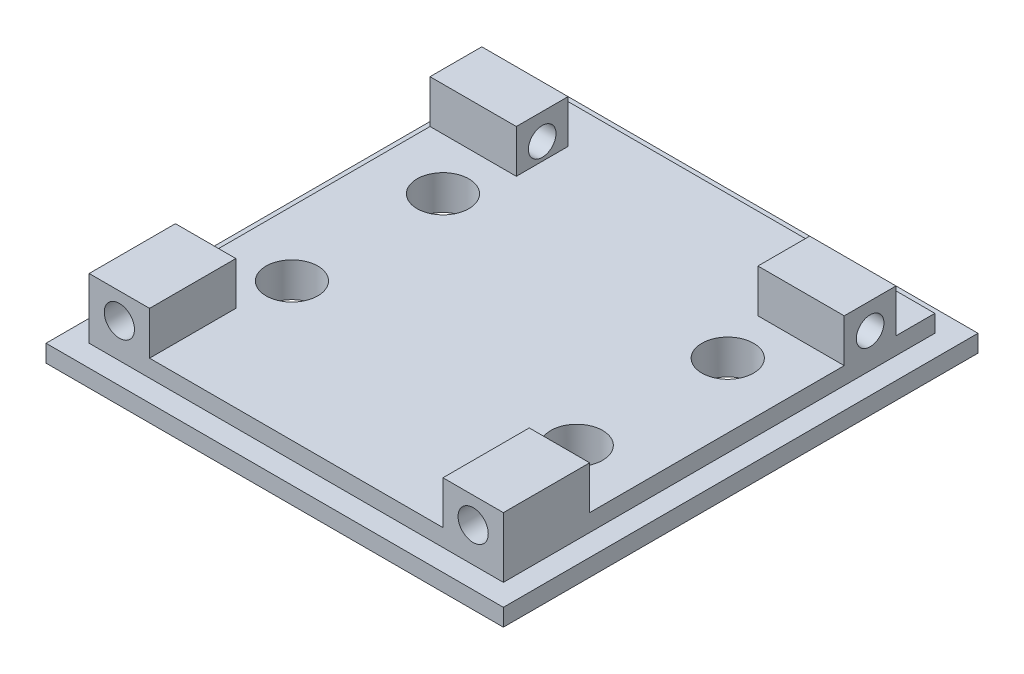
ISO-10303-21;
HEADER;
FILE_DESCRIPTION(('STEP AP214'),'2;1');
FILE_NAME('part.step','',(''),(''),'','','');
FILE_SCHEMA(('AUTOMOTIVE_DESIGN { 1 0 10303 214 1 1 1 1 }'));
ENDSEC;
DATA;
#1=APPLICATION_CONTEXT('core data for automotive mechanical design processes');
#2=APPLICATION_PROTOCOL_DEFINITION('international standard','automotive_design',2000,#1);
#3=PRODUCT_CONTEXT('',#1,'mechanical');
#4=PRODUCT('Part','Part','',(#3));
#5=PRODUCT_RELATED_PRODUCT_CATEGORY('part','',(#4));
#6=PRODUCT_DEFINITION_FORMATION('','',#4);
#7=PRODUCT_DEFINITION_CONTEXT('part definition',#1,'design');
#8=PRODUCT_DEFINITION('design','',#6,#7);
#9=PRODUCT_DEFINITION_SHAPE('','',#8);
#10=(LENGTH_UNIT() NAMED_UNIT(*) SI_UNIT(.MILLI.,.METRE.));
#11=(NAMED_UNIT(*) PLANE_ANGLE_UNIT() SI_UNIT($,.RADIAN.));
#12=(NAMED_UNIT(*) SI_UNIT($,.STERADIAN.) SOLID_ANGLE_UNIT());
#13=UNCERTAINTY_MEASURE_WITH_UNIT(LENGTH_MEASURE(1.E-05),#10,'distance_accuracy_value','');
#14=(GEOMETRIC_REPRESENTATION_CONTEXT(3) GLOBAL_UNCERTAINTY_ASSIGNED_CONTEXT((#13)) GLOBAL_UNIT_ASSIGNED_CONTEXT((#10,
#11,#12)) REPRESENTATION_CONTEXT('',''));
#15=CARTESIAN_POINT('',(0.,0.,0.));
#16=DIRECTION('',(0.,0.,1.));
#17=DIRECTION('',(1.,0.,0.));
#18=AXIS2_PLACEMENT_3D('',#15,#16,#17);
#19=CARTESIAN_POINT('',(0.,4.,0.));
#20=DIRECTION('',(0.,1.,0.));
#21=DIRECTION('',(0.,0.,1.));
#22=AXIS2_PLACEMENT_3D('',#19,#20,#21);
#23=PLANE('',#22);
#24=CARTESIAN_POINT('',(16.5,4.,-8.5));
#25=DIRECTION('',(0.,1.,0.));
#26=DIRECTION('',(0.,0.,-1.));
#27=AXIS2_PLACEMENT_3D('',#24,#25,#26);
#28=CIRCLE('',#27,2.99999999999999);
#29=CARTESIAN_POINT('',(16.5,4.,-11.5));
#30=VERTEX_POINT('',#29);
#31=EDGE_CURVE('E735',#30,#30,#28,.T.);
#32=ORIENTED_EDGE('',*,*,#31,.F.);
#33=EDGE_LOOP('',(#32));
#34=FACE_BOUND('',#33,.T.);
#35=CARTESIAN_POINT('',(16.5,4.,9.));
#36=DIRECTION('',(0.,1.,0.));
#37=DIRECTION('',(0.,0.,-1.));
#38=AXIS2_PLACEMENT_3D('',#35,#36,#37);
#39=CIRCLE('',#38,2.99999999999999);
#40=CARTESIAN_POINT('',(16.5,4.,6.));
#41=VERTEX_POINT('',#40);
#42=EDGE_CURVE('E737',#41,#41,#39,.T.);
#43=ORIENTED_EDGE('',*,*,#42,.F.);
#44=EDGE_LOOP('',(#43));
#45=FACE_BOUND('',#44,.T.);
#46=CARTESIAN_POINT('',(-16.5,4.,-8.5));
#47=DIRECTION('',(0.,1.,0.));
#48=DIRECTION('',(0.,0.,1.));
#49=AXIS2_PLACEMENT_3D('',#46,#47,#48);
#50=CIRCLE('',#49,3.);
#51=CARTESIAN_POINT('',(-16.5,4.,-5.5));
#52=VERTEX_POINT('',#51);
#53=EDGE_CURVE('E745',#52,#52,#50,.T.);
#54=ORIENTED_EDGE('',*,*,#53,.F.);
#55=EDGE_LOOP('',(#54));
#56=FACE_BOUND('',#55,.T.);
#57=CARTESIAN_POINT('',(-16.5,4.,9.));
#58=DIRECTION('',(0.,1.,0.));
#59=DIRECTION('',(0.,0.,1.));
#60=AXIS2_PLACEMENT_3D('',#57,#58,#59);
#61=CIRCLE('',#60,3.);
#62=CARTESIAN_POINT('',(-16.5,4.,12.));
#63=VERTEX_POINT('',#62);
#64=EDGE_CURVE('E751',#63,#63,#61,.T.);
#65=ORIENTED_EDGE('',*,*,#64,.F.);
#66=EDGE_LOOP('',(#65));
#67=FACE_BOUND('',#66,.T.);
#68=DIRECTION('',(0.,0.,1.));
#69=VECTOR('',#68,1.);
#70=CARTESIAN_POINT('',(-24.,4.,25.));
#71=LINE('',#70,#69);
#72=CARTESIAN_POINT('',(-24.,4.,-25.));
#73=VERTEX_POINT('',#72);
#74=CARTESIAN_POINT('',(-24.,4.,-20.5));
#75=VERTEX_POINT('',#74);
#76=EDGE_CURVE('E289',#73,#75,#71,.T.);
#77=ORIENTED_EDGE('',*,*,#76,.T.);
#78=DIRECTION('',(-1.,0.,0.));
#79=VECTOR('',#78,1.);
#80=CARTESIAN_POINT('',(-24.,4.,-20.5));
#81=LINE('',#80,#79);
#82=CARTESIAN_POINT('',(-14.,4.,-20.5));
#83=VERTEX_POINT('',#82);
#84=EDGE_CURVE('E56',#83,#75,#81,.T.);
#85=ORIENTED_EDGE('',*,*,#84,.F.);
#86=DIRECTION('',(0.,0.,-1.));
#87=VECTOR('',#86,1.);
#88=CARTESIAN_POINT('',(-14.,4.,-20.5));
#89=LINE('',#88,#87);
#90=CARTESIAN_POINT('',(-14.,4.,-14.5));
#91=VERTEX_POINT('',#90);
#92=EDGE_CURVE('E51',#91,#83,#89,.T.);
#93=ORIENTED_EDGE('',*,*,#92,.F.);
#94=DIRECTION('',(1.,0.,0.));
#95=VECTOR('',#94,1.);
#96=CARTESIAN_POINT('',(-24.,4.,-14.5));
#97=LINE('',#96,#95);
#98=CARTESIAN_POINT('',(-24.,4.,-14.5));
#99=VERTEX_POINT('',#98);
#100=EDGE_CURVE('E782',#99,#91,#97,.T.);
#101=ORIENTED_EDGE('',*,*,#100,.F.);
#102=CARTESIAN_POINT('',(-24.,4.,15.));
#103=VERTEX_POINT('',#102);
#104=EDGE_CURVE('E288',#99,#103,#71,.T.);
#105=ORIENTED_EDGE('',*,*,#104,.T.);
#106=DIRECTION('',(-1.,0.,0.));
#107=VECTOR('',#106,1.);
#108=CARTESIAN_POINT('',(-24.,4.,15.));
#109=LINE('',#108,#107);
#110=CARTESIAN_POINT('',(-17.,4.,15.));
#111=VERTEX_POINT('',#110);
#112=EDGE_CURVE('E268',#111,#103,#109,.T.);
#113=ORIENTED_EDGE('',*,*,#112,.F.);
#114=DIRECTION('',(0.,0.,-1.));
#115=VECTOR('',#114,1.);
#116=CARTESIAN_POINT('',(-17.,4.,25.));
#117=LINE('',#116,#115);
#118=CARTESIAN_POINT('',(-17.,4.,25.));
#119=VERTEX_POINT('',#118);
#120=EDGE_CURVE('E263',#119,#111,#117,.T.);
#121=ORIENTED_EDGE('',*,*,#120,.F.);
#122=DIRECTION('',(1.,0.,0.));
#123=VECTOR('',#122,1.);
#124=CARTESIAN_POINT('',(24.,4.,25.));
#125=LINE('',#124,#123);
#126=CARTESIAN_POINT('',(17.,4.,25.));
#127=VERTEX_POINT('',#126);
#128=EDGE_CURVE('E298',#119,#127,#125,.T.);
#129=ORIENTED_EDGE('',*,*,#128,.T.);
#130=DIRECTION('',(0.,0.,1.));
#131=VECTOR('',#130,1.);
#132=CARTESIAN_POINT('',(17.,4.,25.));
#133=LINE('',#132,#131);
#134=CARTESIAN_POINT('',(17.,4.,15.));
#135=VERTEX_POINT('',#134);
#136=EDGE_CURVE('E247',#135,#127,#133,.T.);
#137=ORIENTED_EDGE('',*,*,#136,.F.);
#138=DIRECTION('',(-1.,0.,0.));
#139=VECTOR('',#138,1.);
#140=CARTESIAN_POINT('',(24.,4.,15.));
#141=LINE('',#140,#139);
#142=CARTESIAN_POINT('',(24.,4.,15.));
#143=VERTEX_POINT('',#142);
#144=EDGE_CURVE('E242',#143,#135,#141,.T.);
#145=ORIENTED_EDGE('',*,*,#144,.F.);
#146=DIRECTION('',(0.,0.,-1.));
#147=VECTOR('',#146,1.);
#148=CARTESIAN_POINT('',(24.,4.,25.));
#149=LINE('',#148,#147);
#150=CARTESIAN_POINT('',(24.,4.,-14.5));
#151=VERTEX_POINT('',#150);
#152=EDGE_CURVE('E334',#143,#151,#149,.T.);
#153=ORIENTED_EDGE('',*,*,#152,.T.);
#154=DIRECTION('',(1.,0.,0.));
#155=VECTOR('',#154,1.);
#156=CARTESIAN_POINT('',(24.,4.,-14.5));
#157=LINE('',#156,#155);
#158=CARTESIAN_POINT('',(14.,4.,-14.5));
#159=VERTEX_POINT('',#158);
#160=EDGE_CURVE('E220',#159,#151,#157,.T.);
#161=ORIENTED_EDGE('',*,*,#160,.F.);
#162=DIRECTION('',(0.,0.,1.));
#163=VECTOR('',#162,1.);
#164=CARTESIAN_POINT('',(14.,4.,-20.5));
#165=LINE('',#164,#163);
#166=CARTESIAN_POINT('',(14.,4.,-20.5));
#167=VERTEX_POINT('',#166);
#168=EDGE_CURVE('E210',#167,#159,#165,.T.);
#169=ORIENTED_EDGE('',*,*,#168,.F.);
#170=DIRECTION('',(-1.,0.,0.));
#171=VECTOR('',#170,1.);
#172=CARTESIAN_POINT('',(24.,4.,-20.5));
#173=LINE('',#172,#171);
#174=CARTESIAN_POINT('',(24.,4.,-20.5));
#175=VERTEX_POINT('',#174);
#176=EDGE_CURVE('E207',#175,#167,#173,.T.);
#177=ORIENTED_EDGE('',*,*,#176,.F.);
#178=CARTESIAN_POINT('',(24.,4.,-25.));
#179=VERTEX_POINT('',#178);
#180=EDGE_CURVE('E302',#175,#179,#149,.T.);
#181=ORIENTED_EDGE('',*,*,#180,.T.);
#182=DIRECTION('',(-1.,0.,0.));
#183=VECTOR('',#182,1.);
#184=CARTESIAN_POINT('',(24.,4.,-25.));
#185=LINE('',#184,#183);
#186=EDGE_CURVE('E344',#179,#73,#185,.T.);
#187=ORIENTED_EDGE('',*,*,#186,.T.);
#188=EDGE_LOOP('',(#77,#85,#93,#101,#105,#113,#121,#129,#137,#145,#153,#161,#169,#177,#181,#187));
#189=FACE_BOUND('',#188,.T.);
#190=ADVANCED_FACE('F34',(#34,#45,#56,#67,#189),#23,.T.);
#191=CARTESIAN_POINT('',(0.,2.,0.));
#192=DIRECTION('',(0.,1.,0.));
#193=DIRECTION('',(0.,0.,1.));
#194=AXIS2_PLACEMENT_3D('',#191,#192,#193);
#195=PLANE('',#194);
#196=DIRECTION('',(0.,0.,1.));
#197=VECTOR('',#196,1.);
#198=CARTESIAN_POINT('',(-26.5,2.,27.5));
#199=LINE('',#198,#197);
#200=CARTESIAN_POINT('',(-26.5,2.,-27.5));
#201=VERTEX_POINT('',#200);
#202=CARTESIAN_POINT('',(-26.5,2.,27.5));
#203=VERTEX_POINT('',#202);
#204=EDGE_CURVE('E362',#201,#203,#199,.T.);
#205=ORIENTED_EDGE('',*,*,#204,.T.);
#206=DIRECTION('',(1.,0.,0.));
#207=VECTOR('',#206,1.);
#208=CARTESIAN_POINT('',(26.5,2.,27.5));
#209=LINE('',#208,#207);
#210=CARTESIAN_POINT('',(26.5,2.,27.5));
#211=VERTEX_POINT('',#210);
#212=EDGE_CURVE('E365',#203,#211,#209,.T.);
#213=ORIENTED_EDGE('',*,*,#212,.T.);
#214=DIRECTION('',(0.,0.,-1.));
#215=VECTOR('',#214,1.);
#216=CARTESIAN_POINT('',(26.5,2.,27.5));
#217=LINE('',#216,#215);
#218=CARTESIAN_POINT('',(26.5,2.,-27.5));
#219=VERTEX_POINT('',#218);
#220=EDGE_CURVE('E368',#211,#219,#217,.T.);
#221=ORIENTED_EDGE('',*,*,#220,.T.);
#222=DIRECTION('',(-1.,0.,0.));
#223=VECTOR('',#222,1.);
#224=CARTESIAN_POINT('',(26.5,2.,-27.5));
#225=LINE('',#224,#223);
#226=EDGE_CURVE('E370',#219,#201,#225,.T.);
#227=ORIENTED_EDGE('',*,*,#226,.T.);
#228=EDGE_LOOP('',(#205,#213,#221,#227));
#229=FACE_BOUND('',#228,.T.);
#230=DIRECTION('',(1.,0.,0.));
#231=VECTOR('',#230,1.);
#232=CARTESIAN_POINT('',(24.,2.,25.));
#233=LINE('',#232,#231);
#234=CARTESIAN_POINT('',(-24.,2.,25.));
#235=VERTEX_POINT('',#234);
#236=CARTESIAN_POINT('',(24.,2.,25.));
#237=VERTEX_POINT('',#236);
#238=EDGE_CURVE('E312',#235,#237,#233,.T.);
#239=ORIENTED_EDGE('',*,*,#238,.F.);
#240=DIRECTION('',(0.,0.,1.));
#241=VECTOR('',#240,1.);
#242=CARTESIAN_POINT('',(-24.,2.,25.));
#243=LINE('',#242,#241);
#244=CARTESIAN_POINT('',(-24.,2.,-25.));
#245=VERTEX_POINT('',#244);
#246=EDGE_CURVE('E308',#245,#235,#243,.T.);
#247=ORIENTED_EDGE('',*,*,#246,.F.);
#248=DIRECTION('',(-1.,0.,0.));
#249=VECTOR('',#248,1.);
#250=CARTESIAN_POINT('',(24.,2.,-25.));
#251=LINE('',#250,#249);
#252=CARTESIAN_POINT('',(24.,2.,-25.));
#253=VERTEX_POINT('',#252);
#254=EDGE_CURVE('E290',#253,#245,#251,.T.);
#255=ORIENTED_EDGE('',*,*,#254,.F.);
#256=DIRECTION('',(0.,0.,-1.));
#257=VECTOR('',#256,1.);
#258=CARTESIAN_POINT('',(24.,2.,25.));
#259=LINE('',#258,#257);
#260=EDGE_CURVE('E349',#237,#253,#259,.T.);
#261=ORIENTED_EDGE('',*,*,#260,.F.);
#262=EDGE_LOOP('',(#239,#247,#255,#261));
#263=FACE_BOUND('',#262,.T.);
#264=ADVANCED_FACE('F404',(#229,#263),#195,.T.);
#265=CARTESIAN_POINT('',(-26.5,2.,27.5));
#266=DIRECTION('',(1.,0.,0.));
#267=DIRECTION('',(0.,0.,-1.));
#268=AXIS2_PLACEMENT_3D('',#265,#266,#267);
#269=PLANE('',#268);
#270=DIRECTION('',(0.,0.,1.));
#271=VECTOR('',#270,1.);
#272=CARTESIAN_POINT('',(-26.5,0.,27.5));
#273=LINE('',#272,#271);
#274=CARTESIAN_POINT('',(-26.5,0.,-27.5));
#275=VERTEX_POINT('',#274);
#276=CARTESIAN_POINT('',(-26.5,0.,27.5));
#277=VERTEX_POINT('',#276);
#278=EDGE_CURVE('E361',#275,#277,#273,.T.);
#279=ORIENTED_EDGE('',*,*,#278,.T.);
#280=DIRECTION('',(0.,-1.,0.));
#281=VECTOR('',#280,1.);
#282=CARTESIAN_POINT('',(-26.5,2.,27.5));
#283=LINE('',#282,#281);
#284=EDGE_CURVE('E12',#203,#277,#283,.T.);
#285=ORIENTED_EDGE('',*,*,#284,.F.);
#286=ORIENTED_EDGE('',*,*,#204,.F.);
#287=DIRECTION('',(0.,-1.,0.));
#288=VECTOR('',#287,1.);
#289=CARTESIAN_POINT('',(-26.5,2.,-27.5));
#290=LINE('',#289,#288);
#291=EDGE_CURVE('E372',#201,#275,#290,.T.);
#292=ORIENTED_EDGE('',*,*,#291,.T.);
#293=EDGE_LOOP('',(#279,#285,#286,#292));
#294=FACE_BOUND('',#293,.T.);
#295=ADVANCED_FACE('F36',(#294),#269,.F.);
#296=CARTESIAN_POINT('',(26.5,2.,27.5));
#297=DIRECTION('',(0.,0.,-1.));
#298=DIRECTION('',(-1.,0.,0.));
#299=AXIS2_PLACEMENT_3D('',#296,#297,#298);
#300=PLANE('',#299);
#301=DIRECTION('',(1.,0.,0.));
#302=VECTOR('',#301,1.);
#303=CARTESIAN_POINT('',(26.5,0.,27.5));
#304=LINE('',#303,#302);
#305=CARTESIAN_POINT('',(26.5,0.,27.5));
#306=VERTEX_POINT('',#305);
#307=EDGE_CURVE('E375',#277,#306,#304,.T.);
#308=ORIENTED_EDGE('',*,*,#307,.T.);
#309=DIRECTION('',(0.,-1.,0.));
#310=VECTOR('',#309,1.);
#311=CARTESIAN_POINT('',(26.5,2.,27.5));
#312=LINE('',#311,#310);
#313=EDGE_CURVE('E43',#211,#306,#312,.T.);
#314=ORIENTED_EDGE('',*,*,#313,.F.);
#315=ORIENTED_EDGE('',*,*,#212,.F.);
#316=ORIENTED_EDGE('',*,*,#284,.T.);
#317=EDGE_LOOP('',(#308,#314,#315,#316));
#318=FACE_BOUND('',#317,.T.);
#319=ADVANCED_FACE('F406',(#318),#300,.F.);
#320=CARTESIAN_POINT('',(26.5,2.,27.5));
#321=DIRECTION('',(-1.,0.,0.));
#322=DIRECTION('',(0.,0.,1.));
#323=AXIS2_PLACEMENT_3D('',#320,#321,#322);
#324=PLANE('',#323);
#325=DIRECTION('',(0.,0.,-1.));
#326=VECTOR('',#325,1.);
#327=CARTESIAN_POINT('',(26.5,0.,27.5));
#328=LINE('',#327,#326);
#329=CARTESIAN_POINT('',(26.5,0.,-27.5));
#330=VERTEX_POINT('',#329);
#331=EDGE_CURVE('E377',#306,#330,#328,.T.);
#332=ORIENTED_EDGE('',*,*,#331,.T.);
#333=DIRECTION('',(0.,-1.,0.));
#334=VECTOR('',#333,1.);
#335=CARTESIAN_POINT('',(26.5,2.,-27.5));
#336=LINE('',#335,#334);
#337=EDGE_CURVE('E382',#219,#330,#336,.T.);
#338=ORIENTED_EDGE('',*,*,#337,.F.);
#339=ORIENTED_EDGE('',*,*,#220,.F.);
#340=ORIENTED_EDGE('',*,*,#313,.T.);
#341=EDGE_LOOP('',(#332,#338,#339,#340));
#342=FACE_BOUND('',#341,.T.);
#343=ADVANCED_FACE('F389',(#342),#324,.F.);
#344=CARTESIAN_POINT('',(26.5,2.,-27.5));
#345=DIRECTION('',(0.,0.,1.));
#346=DIRECTION('',(1.,0.,0.));
#347=AXIS2_PLACEMENT_3D('',#344,#345,#346);
#348=PLANE('',#347);
#349=DIRECTION('',(-1.,0.,0.));
#350=VECTOR('',#349,1.);
#351=CARTESIAN_POINT('',(26.5,0.,-27.5));
#352=LINE('',#351,#350);
#353=EDGE_CURVE('E366',#330,#275,#352,.T.);
#354=ORIENTED_EDGE('',*,*,#353,.T.);
#355=ORIENTED_EDGE('',*,*,#291,.F.);
#356=ORIENTED_EDGE('',*,*,#226,.F.);
#357=ORIENTED_EDGE('',*,*,#337,.T.);
#358=EDGE_LOOP('',(#354,#355,#356,#357));
#359=FACE_BOUND('',#358,.T.);
#360=ADVANCED_FACE('F398',(#359),#348,.F.);
#361=CARTESIAN_POINT('',(0.,0.,0.));
#362=DIRECTION('',(0.,1.,0.));
#363=DIRECTION('',(0.,0.,1.));
#364=AXIS2_PLACEMENT_3D('',#361,#362,#363);
#365=PLANE('',#364);
#366=CARTESIAN_POINT('',(16.5,0.,-8.5));
#367=DIRECTION('',(0.,1.,0.));
#368=DIRECTION('',(0.,0.,1.));
#369=AXIS2_PLACEMENT_3D('',#366,#367,#368);
#370=CIRCLE('',#369,2.99999999999999);
#371=CARTESIAN_POINT('',(16.5,0.,-5.5));
#372=VERTEX_POINT('',#371);
#373=EDGE_CURVE('E733',#372,#372,#370,.F.);
#374=ORIENTED_EDGE('',*,*,#373,.F.);
#375=EDGE_LOOP('',(#374));
#376=FACE_BOUND('',#375,.T.);
#377=CARTESIAN_POINT('',(16.5,0.,9.));
#378=DIRECTION('',(0.,1.,0.));
#379=DIRECTION('',(0.,0.,1.));
#380=AXIS2_PLACEMENT_3D('',#377,#378,#379);
#381=CIRCLE('',#380,2.99999999999999);
#382=CARTESIAN_POINT('',(16.5,0.,12.));
#383=VERTEX_POINT('',#382);
#384=EDGE_CURVE('E742',#383,#383,#381,.F.);
#385=ORIENTED_EDGE('',*,*,#384,.F.);
#386=EDGE_LOOP('',(#385));
#387=FACE_BOUND('',#386,.T.);
#388=CARTESIAN_POINT('',(-16.5,0.,-8.5));
#389=DIRECTION('',(0.,1.,0.));
#390=DIRECTION('',(0.,0.,1.));
#391=AXIS2_PLACEMENT_3D('',#388,#389,#390);
#392=CIRCLE('',#391,3.);
#393=CARTESIAN_POINT('',(-16.5,0.,-5.5));
#394=VERTEX_POINT('',#393);
#395=EDGE_CURVE('E748',#394,#394,#392,.F.);
#396=ORIENTED_EDGE('',*,*,#395,.F.);
#397=EDGE_LOOP('',(#396));
#398=FACE_BOUND('',#397,.T.);
#399=CARTESIAN_POINT('',(-16.5,0.,9.));
#400=DIRECTION('',(0.,1.,0.));
#401=DIRECTION('',(0.,0.,1.));
#402=AXIS2_PLACEMENT_3D('',#399,#400,#401);
#403=CIRCLE('',#402,3.);
#404=CARTESIAN_POINT('',(-16.5,0.,12.));
#405=VERTEX_POINT('',#404);
#406=EDGE_CURVE('E754',#405,#405,#403,.F.);
#407=ORIENTED_EDGE('',*,*,#406,.F.);
#408=EDGE_LOOP('',(#407));
#409=FACE_BOUND('',#408,.T.);
#410=ORIENTED_EDGE('',*,*,#278,.F.);
#411=ORIENTED_EDGE('',*,*,#353,.F.);
#412=ORIENTED_EDGE('',*,*,#331,.F.);
#413=ORIENTED_EDGE('',*,*,#307,.F.);
#414=EDGE_LOOP('',(#410,#411,#412,#413));
#415=FACE_BOUND('',#414,.T.);
#416=ADVANCED_FACE('F395',(#376,#387,#398,#409,#415),#365,.F.);
#417=CARTESIAN_POINT('',(-24.,4.,25.));
#418=DIRECTION('',(1.,0.,0.));
#419=DIRECTION('',(0.,0.,-1.));
#420=AXIS2_PLACEMENT_3D('',#417,#418,#419);
#421=PLANE('',#420);
#422=CARTESIAN_POINT('',(-24.,6.,-17.5));
#423=DIRECTION('',(1.,0.,0.));
#424=DIRECTION('',(0.,0.,-1.));
#425=AXIS2_PLACEMENT_3D('',#422,#423,#424);
#426=CIRCLE('',#425,1.6);
#427=CARTESIAN_POINT('',(-24.,6.,-19.1));
#428=VERTEX_POINT('',#427);
#429=EDGE_CURVE('E760',#428,#428,#426,.F.);
#430=ORIENTED_EDGE('',*,*,#429,.F.);
#431=EDGE_LOOP('',(#430));
#432=FACE_BOUND('',#431,.T.);
#433=ORIENTED_EDGE('',*,*,#246,.T.);
#434=DIRECTION('',(0.,-1.,0.));
#435=VECTOR('',#434,1.);
#436=CARTESIAN_POINT('',(-24.,4.,25.));
#437=LINE('',#436,#435);
#438=CARTESIAN_POINT('',(-24.,9.,25.));
#439=VERTEX_POINT('',#438);
#440=EDGE_CURVE('E359',#439,#235,#437,.T.);
#441=ORIENTED_EDGE('',*,*,#440,.F.);
#442=DIRECTION('',(0.,0.,1.));
#443=VECTOR('',#442,1.);
#444=CARTESIAN_POINT('',(-24.,9.,25.));
#445=LINE('',#444,#443);
#446=CARTESIAN_POINT('',(-24.,9.,15.));
#447=VERTEX_POINT('',#446);
#448=EDGE_CURVE('E264',#447,#439,#445,.T.);
#449=ORIENTED_EDGE('',*,*,#448,.F.);
#450=DIRECTION('',(0.,-1.,0.));
#451=VECTOR('',#450,1.);
#452=CARTESIAN_POINT('',(-24.,9.,15.));
#453=LINE('',#452,#451);
#454=EDGE_CURVE('E274',#447,#103,#453,.T.);
#455=ORIENTED_EDGE('',*,*,#454,.T.);
#456=ORIENTED_EDGE('',*,*,#104,.F.);
#457=DIRECTION('',(0.,-1.,0.));
#458=VECTOR('',#457,1.);
#459=CARTESIAN_POINT('',(-24.,9.,-14.5));
#460=LINE('',#459,#458);
#461=CARTESIAN_POINT('',(-24.,9.,-14.5));
#462=VERTEX_POINT('',#461);
#463=EDGE_CURVE('E192',#462,#99,#460,.T.);
#464=ORIENTED_EDGE('',*,*,#463,.F.);
#465=DIRECTION('',(0.,0.,1.));
#466=VECTOR('',#465,1.);
#467=CARTESIAN_POINT('',(-24.,9.,-20.5));
#468=LINE('',#467,#466);
#469=CARTESIAN_POINT('',(-24.,9.,-20.5));
#470=VERTEX_POINT('',#469);
#471=EDGE_CURVE('E184',#470,#462,#468,.T.);
#472=ORIENTED_EDGE('',*,*,#471,.F.);
#473=DIRECTION('',(0.,-1.,0.));
#474=VECTOR('',#473,1.);
#475=CARTESIAN_POINT('',(-24.,9.,-20.5));
#476=LINE('',#475,#474);
#477=EDGE_CURVE('E190',#470,#75,#476,.T.);
#478=ORIENTED_EDGE('',*,*,#477,.T.);
#479=ORIENTED_EDGE('',*,*,#76,.F.);
#480=DIRECTION('',(0.,-1.,0.));
#481=VECTOR('',#480,1.);
#482=CARTESIAN_POINT('',(-24.,4.,-25.));
#483=LINE('',#482,#481);
#484=EDGE_CURVE('E345',#73,#245,#483,.T.);
#485=ORIENTED_EDGE('',*,*,#484,.T.);
#486=EDGE_LOOP('',(#433,#441,#449,#455,#456,#464,#472,#478,#479,#485));
#487=FACE_BOUND('',#486,.T.);
#488=ADVANCED_FACE('F187',(#432,#487),#421,.F.);
#489=CARTESIAN_POINT('',(24.,4.,25.));
#490=DIRECTION('',(0.,0.,-1.));
#491=DIRECTION('',(-1.,0.,0.));
#492=AXIS2_PLACEMENT_3D('',#489,#490,#491);
#493=PLANE('',#492);
#494=CARTESIAN_POINT('',(20.5,6.,25.));
#495=DIRECTION('',(0.,0.,1.));
#496=DIRECTION('',(-1.,0.,0.));
#497=AXIS2_PLACEMENT_3D('',#494,#495,#496);
#498=CIRCLE('',#497,1.75);
#499=CARTESIAN_POINT('',(18.75,6.,25.));
#500=VERTEX_POINT('',#499);
#501=EDGE_CURVE('E766',#500,#500,#498,.T.);
#502=ORIENTED_EDGE('',*,*,#501,.F.);
#503=EDGE_LOOP('',(#502));
#504=FACE_BOUND('',#503,.T.);
#505=CARTESIAN_POINT('',(-20.5,6.,25.));
#506=DIRECTION('',(0.,0.,1.));
#507=DIRECTION('',(1.,0.,0.));
#508=AXIS2_PLACEMENT_3D('',#505,#506,#507);
#509=CIRCLE('',#508,1.75);
#510=CARTESIAN_POINT('',(-18.75,6.,25.));
#511=VERTEX_POINT('',#510);
#512=EDGE_CURVE('E772',#511,#511,#509,.T.);
#513=ORIENTED_EDGE('',*,*,#512,.F.);
#514=EDGE_LOOP('',(#513));
#515=FACE_BOUND('',#514,.T.);
#516=ORIENTED_EDGE('',*,*,#238,.T.);
#517=DIRECTION('',(0.,-1.,0.));
#518=VECTOR('',#517,1.);
#519=CARTESIAN_POINT('',(24.,4.,25.));
#520=LINE('',#519,#518);
#521=CARTESIAN_POINT('',(24.,9.,25.));
#522=VERTEX_POINT('',#521);
#523=EDGE_CURVE('E356',#522,#237,#520,.T.);
#524=ORIENTED_EDGE('',*,*,#523,.F.);
#525=DIRECTION('',(1.,0.,0.));
#526=VECTOR('',#525,1.);
#527=CARTESIAN_POINT('',(24.,9.,25.));
#528=LINE('',#527,#526);
#529=CARTESIAN_POINT('',(17.,9.,25.));
#530=VERTEX_POINT('',#529);
#531=EDGE_CURVE('E243',#530,#522,#528,.T.);
#532=ORIENTED_EDGE('',*,*,#531,.F.);
#533=DIRECTION('',(0.,-1.,0.));
#534=VECTOR('',#533,1.);
#535=CARTESIAN_POINT('',(17.,9.,25.));
#536=LINE('',#535,#534);
#537=EDGE_CURVE('E253',#530,#127,#536,.T.);
#538=ORIENTED_EDGE('',*,*,#537,.T.);
#539=ORIENTED_EDGE('',*,*,#128,.F.);
#540=DIRECTION('',(0.,-1.,0.));
#541=VECTOR('',#540,1.);
#542=CARTESIAN_POINT('',(-17.,9.,25.));
#543=LINE('',#542,#541);
#544=CARTESIAN_POINT('',(-17.,9.,25.));
#545=VERTEX_POINT('',#544);
#546=EDGE_CURVE('E306',#545,#119,#543,.T.);
#547=ORIENTED_EDGE('',*,*,#546,.F.);
#548=DIRECTION('',(1.,0.,0.));
#549=VECTOR('',#548,1.);
#550=CARTESIAN_POINT('',(-24.,9.,25.));
#551=LINE('',#550,#549);
#552=EDGE_CURVE('E267',#439,#545,#551,.T.);
#553=ORIENTED_EDGE('',*,*,#552,.F.);
#554=ORIENTED_EDGE('',*,*,#440,.T.);
#555=EDGE_LOOP('',(#516,#524,#532,#538,#539,#547,#553,#554));
#556=FACE_BOUND('',#555,.T.);
#557=ADVANCED_FACE('F324',(#504,#515,#556),#493,.F.);
#558=CARTESIAN_POINT('',(24.,4.,25.));
#559=DIRECTION('',(-1.,0.,0.));
#560=DIRECTION('',(0.,0.,1.));
#561=AXIS2_PLACEMENT_3D('',#558,#559,#560);
#562=PLANE('',#561);
#563=CARTESIAN_POINT('',(24.,6.,-17.5));
#564=DIRECTION('',(1.,0.,0.));
#565=DIRECTION('',(0.,0.,-1.));
#566=AXIS2_PLACEMENT_3D('',#563,#564,#565);
#567=CIRCLE('',#566,1.6);
#568=CARTESIAN_POINT('',(24.,6.,-19.1));
#569=VERTEX_POINT('',#568);
#570=EDGE_CURVE('E757',#569,#569,#567,.T.);
#571=ORIENTED_EDGE('',*,*,#570,.F.);
#572=EDGE_LOOP('',(#571));
#573=FACE_BOUND('',#572,.T.);
#574=ORIENTED_EDGE('',*,*,#260,.T.);
#575=DIRECTION('',(0.,-1.,0.));
#576=VECTOR('',#575,1.);
#577=CARTESIAN_POINT('',(24.,4.,-25.));
#578=LINE('',#577,#576);
#579=EDGE_CURVE('E354',#179,#253,#578,.T.);
#580=ORIENTED_EDGE('',*,*,#579,.F.);
#581=ORIENTED_EDGE('',*,*,#180,.F.);
#582=DIRECTION('',(0.,-1.,0.));
#583=VECTOR('',#582,1.);
#584=CARTESIAN_POINT('',(24.,9.,-20.5));
#585=LINE('',#584,#583);
#586=CARTESIAN_POINT('',(24.,9.,-20.5));
#587=VERTEX_POINT('',#586);
#588=EDGE_CURVE('E239',#587,#175,#585,.T.);
#589=ORIENTED_EDGE('',*,*,#588,.F.);
#590=DIRECTION('',(0.,0.,-1.));
#591=VECTOR('',#590,1.);
#592=CARTESIAN_POINT('',(24.,9.,-20.5));
#593=LINE('',#592,#591);
#594=CARTESIAN_POINT('',(24.,9.,-14.5));
#595=VERTEX_POINT('',#594);
#596=EDGE_CURVE('E216',#595,#587,#593,.T.);
#597=ORIENTED_EDGE('',*,*,#596,.F.);
#598=DIRECTION('',(0.,-1.,0.));
#599=VECTOR('',#598,1.);
#600=CARTESIAN_POINT('',(24.,9.,-14.5));
#601=LINE('',#600,#599);
#602=EDGE_CURVE('E225',#595,#151,#601,.T.);
#603=ORIENTED_EDGE('',*,*,#602,.T.);
#604=ORIENTED_EDGE('',*,*,#152,.F.);
#605=DIRECTION('',(0.,-1.,0.));
#606=VECTOR('',#605,1.);
#607=CARTESIAN_POINT('',(24.,9.,15.));
#608=LINE('',#607,#606);
#609=CARTESIAN_POINT('',(24.,9.,15.));
#610=VERTEX_POINT('',#609);
#611=EDGE_CURVE('E261',#610,#143,#608,.T.);
#612=ORIENTED_EDGE('',*,*,#611,.F.);
#613=DIRECTION('',(0.,0.,-1.));
#614=VECTOR('',#613,1.);
#615=CARTESIAN_POINT('',(24.,9.,25.));
#616=LINE('',#615,#614);
#617=EDGE_CURVE('E246',#522,#610,#616,.T.);
#618=ORIENTED_EDGE('',*,*,#617,.F.);
#619=ORIENTED_EDGE('',*,*,#523,.T.);
#620=EDGE_LOOP('',(#574,#580,#581,#589,#597,#603,#604,#612,#618,#619));
#621=FACE_BOUND('',#620,.T.);
#622=ADVANCED_FACE('F339',(#573,#621),#562,.F.);
#623=CARTESIAN_POINT('',(24.,4.,-25.));
#624=DIRECTION('',(0.,0.,1.));
#625=DIRECTION('',(1.,0.,0.));
#626=AXIS2_PLACEMENT_3D('',#623,#624,#625);
#627=PLANE('',#626);
#628=ORIENTED_EDGE('',*,*,#254,.T.);
#629=ORIENTED_EDGE('',*,*,#484,.F.);
#630=ORIENTED_EDGE('',*,*,#186,.F.);
#631=ORIENTED_EDGE('',*,*,#579,.T.);
#632=EDGE_LOOP('',(#628,#629,#630,#631));
#633=FACE_BOUND('',#632,.T.);
#634=ADVANCED_FACE('F425',(#633),#627,.F.);
#635=CARTESIAN_POINT('',(-17.,9.,25.));
#636=DIRECTION('',(-1.,0.,0.));
#637=DIRECTION('',(0.,0.,1.));
#638=AXIS2_PLACEMENT_3D('',#635,#636,#637);
#639=PLANE('',#638);
#640=ORIENTED_EDGE('',*,*,#120,.T.);
#641=DIRECTION('',(0.,-1.,0.));
#642=VECTOR('',#641,1.);
#643=CARTESIAN_POINT('',(-17.,9.,15.));
#644=LINE('',#643,#642);
#645=CARTESIAN_POINT('',(-17.,9.,15.));
#646=VERTEX_POINT('',#645);
#647=EDGE_CURVE('E277',#646,#111,#644,.T.);
#648=ORIENTED_EDGE('',*,*,#647,.F.);
#649=DIRECTION('',(0.,0.,-1.));
#650=VECTOR('',#649,1.);
#651=CARTESIAN_POINT('',(-17.,9.,25.));
#652=LINE('',#651,#650);
#653=EDGE_CURVE('E270',#545,#646,#652,.T.);
#654=ORIENTED_EDGE('',*,*,#653,.F.);
#655=ORIENTED_EDGE('',*,*,#546,.T.);
#656=EDGE_LOOP('',(#640,#648,#654,#655));
#657=FACE_BOUND('',#656,.T.);
#658=ADVANCED_FACE('F320',(#657),#639,.F.);
#659=CARTESIAN_POINT('',(-24.,9.,15.));
#660=DIRECTION('',(0.,0.,1.));
#661=DIRECTION('',(1.,0.,0.));
#662=AXIS2_PLACEMENT_3D('',#659,#660,#661);
#663=PLANE('',#662);
#664=CARTESIAN_POINT('',(-20.5,6.,15.));
#665=DIRECTION('',(0.,0.,1.));
#666=DIRECTION('',(1.,0.,0.));
#667=AXIS2_PLACEMENT_3D('',#664,#665,#666);
#668=CIRCLE('',#667,1.75);
#669=CARTESIAN_POINT('',(-18.75,6.,15.));
#670=VERTEX_POINT('',#669);
#671=EDGE_CURVE('E775',#670,#670,#668,.F.);
#672=ORIENTED_EDGE('',*,*,#671,.F.);
#673=EDGE_LOOP('',(#672));
#674=FACE_BOUND('',#673,.T.);
#675=ORIENTED_EDGE('',*,*,#112,.T.);
#676=ORIENTED_EDGE('',*,*,#454,.F.);
#677=DIRECTION('',(-1.,0.,0.));
#678=VECTOR('',#677,1.);
#679=CARTESIAN_POINT('',(-24.,9.,15.));
#680=LINE('',#679,#678);
#681=EDGE_CURVE('E272',#646,#447,#680,.T.);
#682=ORIENTED_EDGE('',*,*,#681,.F.);
#683=ORIENTED_EDGE('',*,*,#647,.T.);
#684=EDGE_LOOP('',(#675,#676,#682,#683));
#685=FACE_BOUND('',#684,.T.);
#686=ADVANCED_FACE('F318',(#674,#685),#663,.F.);
#687=CARTESIAN_POINT('',(0.,9.,0.));
#688=DIRECTION('',(0.,-1.,0.));
#689=DIRECTION('',(0.,0.,-1.));
#690=AXIS2_PLACEMENT_3D('',#687,#688,#689);
#691=PLANE('',#690);
#692=ORIENTED_EDGE('',*,*,#448,.T.);
#693=ORIENTED_EDGE('',*,*,#552,.T.);
#694=ORIENTED_EDGE('',*,*,#653,.T.);
#695=ORIENTED_EDGE('',*,*,#681,.T.);
#696=EDGE_LOOP('',(#692,#693,#694,#695));
#697=FACE_BOUND('',#696,.T.);
#698=ADVANCED_FACE('F483',(#697),#691,.F.);
#699=CARTESIAN_POINT('',(24.,9.,15.));
#700=DIRECTION('',(0.,0.,1.));
#701=DIRECTION('',(1.,0.,0.));
#702=AXIS2_PLACEMENT_3D('',#699,#700,#701);
#703=PLANE('',#702);
#704=CARTESIAN_POINT('',(20.5,6.,15.));
#705=DIRECTION('',(0.,0.,1.));
#706=DIRECTION('',(1.,0.,0.));
#707=AXIS2_PLACEMENT_3D('',#704,#705,#706);
#708=CIRCLE('',#707,1.75);
#709=CARTESIAN_POINT('',(22.25,6.,15.));
#710=VERTEX_POINT('',#709);
#711=EDGE_CURVE('E769',#710,#710,#708,.F.);
#712=ORIENTED_EDGE('',*,*,#711,.F.);
#713=EDGE_LOOP('',(#712));
#714=FACE_BOUND('',#713,.T.);
#715=ORIENTED_EDGE('',*,*,#144,.T.);
#716=DIRECTION('',(0.,-1.,0.));
#717=VECTOR('',#716,1.);
#718=CARTESIAN_POINT('',(17.,9.,15.));
#719=LINE('',#718,#717);
#720=CARTESIAN_POINT('',(17.,9.,15.));
#721=VERTEX_POINT('',#720);
#722=EDGE_CURVE('E259',#721,#135,#719,.T.);
#723=ORIENTED_EDGE('',*,*,#722,.F.);
#724=DIRECTION('',(-1.,0.,0.));
#725=VECTOR('',#724,1.);
#726=CARTESIAN_POINT('',(24.,9.,15.));
#727=LINE('',#726,#725);
#728=EDGE_CURVE('E249',#610,#721,#727,.T.);
#729=ORIENTED_EDGE('',*,*,#728,.F.);
#730=ORIENTED_EDGE('',*,*,#611,.T.);
#731=EDGE_LOOP('',(#715,#723,#729,#730));
#732=FACE_BOUND('',#731,.T.);
#733=ADVANCED_FACE('F490',(#714,#732),#703,.F.);
#734=CARTESIAN_POINT('',(17.,9.,25.));
#735=DIRECTION('',(1.,0.,0.));
#736=DIRECTION('',(0.,0.,-1.));
#737=AXIS2_PLACEMENT_3D('',#734,#735,#736);
#738=PLANE('',#737);
#739=ORIENTED_EDGE('',*,*,#136,.T.);
#740=ORIENTED_EDGE('',*,*,#537,.F.);
#741=DIRECTION('',(0.,0.,1.));
#742=VECTOR('',#741,1.);
#743=CARTESIAN_POINT('',(17.,9.,25.));
#744=LINE('',#743,#742);
#745=EDGE_CURVE('E251',#721,#530,#744,.T.);
#746=ORIENTED_EDGE('',*,*,#745,.F.);
#747=ORIENTED_EDGE('',*,*,#722,.T.);
#748=EDGE_LOOP('',(#739,#740,#746,#747));
#749=FACE_BOUND('',#748,.T.);
#750=ADVANCED_FACE('F330',(#749),#738,.F.);
#751=CARTESIAN_POINT('',(0.,9.,0.));
#752=DIRECTION('',(0.,-1.,0.));
#753=DIRECTION('',(0.,0.,-1.));
#754=AXIS2_PLACEMENT_3D('',#751,#752,#753);
#755=PLANE('',#754);
#756=ORIENTED_EDGE('',*,*,#531,.T.);
#757=ORIENTED_EDGE('',*,*,#617,.T.);
#758=ORIENTED_EDGE('',*,*,#728,.T.);
#759=ORIENTED_EDGE('',*,*,#745,.T.);
#760=EDGE_LOOP('',(#756,#757,#758,#759));
#761=FACE_BOUND('',#760,.T.);
#762=ADVANCED_FACE('F505',(#761),#755,.F.);
#763=CARTESIAN_POINT('',(24.,9.,-20.5));
#764=DIRECTION('',(0.,0.,1.));
#765=DIRECTION('',(1.,0.,0.));
#766=AXIS2_PLACEMENT_3D('',#763,#764,#765);
#767=PLANE('',#766);
#768=ORIENTED_EDGE('',*,*,#176,.T.);
#769=DIRECTION('',(0.,-1.,0.));
#770=VECTOR('',#769,1.);
#771=CARTESIAN_POINT('',(14.,9.,-20.5));
#772=LINE('',#771,#770);
#773=CARTESIAN_POINT('',(14.,9.,-20.5));
#774=VERTEX_POINT('',#773);
#775=EDGE_CURVE('E236',#774,#167,#772,.T.);
#776=ORIENTED_EDGE('',*,*,#775,.F.);
#777=DIRECTION('',(-1.,0.,0.));
#778=VECTOR('',#777,1.);
#779=CARTESIAN_POINT('',(24.,9.,-20.5));
#780=LINE('',#779,#778);
#781=EDGE_CURVE('E219',#587,#774,#780,.T.);
#782=ORIENTED_EDGE('',*,*,#781,.F.);
#783=ORIENTED_EDGE('',*,*,#588,.T.);
#784=EDGE_LOOP('',(#768,#776,#782,#783));
#785=FACE_BOUND('',#784,.T.);
#786=ADVANCED_FACE('F512',(#785),#767,.F.);
#787=CARTESIAN_POINT('',(14.,9.,-20.5));
#788=DIRECTION('',(1.,0.,0.));
#789=DIRECTION('',(0.,0.,-1.));
#790=AXIS2_PLACEMENT_3D('',#787,#788,#789);
#791=PLANE('',#790);
#792=CARTESIAN_POINT('',(14.,6.,-17.5));
#793=DIRECTION('',(1.,0.,0.));
#794=DIRECTION('',(0.,0.,-1.));
#795=AXIS2_PLACEMENT_3D('',#792,#793,#794);
#796=CIRCLE('',#795,1.6);
#797=CARTESIAN_POINT('',(14.,6.,-19.1));
#798=VERTEX_POINT('',#797);
#799=EDGE_CURVE('E763',#798,#798,#796,.T.);
#800=ORIENTED_EDGE('',*,*,#799,.T.);
#801=EDGE_LOOP('',(#800));
#802=FACE_BOUND('',#801,.T.);
#803=ORIENTED_EDGE('',*,*,#168,.T.);
#804=DIRECTION('',(0.,-1.,0.));
#805=VECTOR('',#804,1.);
#806=CARTESIAN_POINT('',(14.,9.,-14.5));
#807=LINE('',#806,#805);
#808=CARTESIAN_POINT('',(14.,9.,-14.5));
#809=VERTEX_POINT('',#808);
#810=EDGE_CURVE('E233',#809,#159,#807,.T.);
#811=ORIENTED_EDGE('',*,*,#810,.F.);
#812=DIRECTION('',(0.,0.,1.));
#813=VECTOR('',#812,1.);
#814=CARTESIAN_POINT('',(14.,9.,-20.5));
#815=LINE('',#814,#813);
#816=EDGE_CURVE('E222',#774,#809,#815,.T.);
#817=ORIENTED_EDGE('',*,*,#816,.F.);
#818=ORIENTED_EDGE('',*,*,#775,.T.);
#819=EDGE_LOOP('',(#803,#811,#817,#818));
#820=FACE_BOUND('',#819,.T.);
#821=ADVANCED_FACE('F520',(#802,#820),#791,.F.);
#822=CARTESIAN_POINT('',(24.,9.,-14.5));
#823=DIRECTION('',(0.,0.,-1.));
#824=DIRECTION('',(-1.,0.,0.));
#825=AXIS2_PLACEMENT_3D('',#822,#823,#824);
#826=PLANE('',#825);
#827=ORIENTED_EDGE('',*,*,#160,.T.);
#828=ORIENTED_EDGE('',*,*,#602,.F.);
#829=DIRECTION('',(1.,0.,0.));
#830=VECTOR('',#829,1.);
#831=CARTESIAN_POINT('',(24.,9.,-14.5));
#832=LINE('',#831,#830);
#833=EDGE_CURVE('E224',#809,#595,#832,.T.);
#834=ORIENTED_EDGE('',*,*,#833,.F.);
#835=ORIENTED_EDGE('',*,*,#810,.T.);
#836=EDGE_LOOP('',(#827,#828,#834,#835));
#837=FACE_BOUND('',#836,.T.);
#838=ADVANCED_FACE('F528',(#837),#826,.F.);
#839=CARTESIAN_POINT('',(0.,9.,0.));
#840=DIRECTION('',(0.,-1.,0.));
#841=DIRECTION('',(0.,0.,-1.));
#842=AXIS2_PLACEMENT_3D('',#839,#840,#841);
#843=PLANE('',#842);
#844=ORIENTED_EDGE('',*,*,#596,.T.);
#845=ORIENTED_EDGE('',*,*,#781,.T.);
#846=ORIENTED_EDGE('',*,*,#816,.T.);
#847=ORIENTED_EDGE('',*,*,#833,.T.);
#848=EDGE_LOOP('',(#844,#845,#846,#847));
#849=FACE_BOUND('',#848,.T.);
#850=ADVANCED_FACE('F536',(#849),#843,.F.);
#851=CARTESIAN_POINT('',(-24.,9.,-20.5));
#852=DIRECTION('',(0.,0.,1.));
#853=DIRECTION('',(1.,0.,0.));
#854=AXIS2_PLACEMENT_3D('',#851,#852,#853);
#855=PLANE('',#854);
#856=ORIENTED_EDGE('',*,*,#84,.T.);
#857=ORIENTED_EDGE('',*,*,#477,.F.);
#858=DIRECTION('',(-1.,0.,0.));
#859=VECTOR('',#858,1.);
#860=CARTESIAN_POINT('',(-24.,9.,-20.5));
#861=LINE('',#860,#859);
#862=CARTESIAN_POINT('',(-14.,9.,-20.5));
#863=VERTEX_POINT('',#862);
#864=EDGE_CURVE('E196',#863,#470,#861,.T.);
#865=ORIENTED_EDGE('',*,*,#864,.F.);
#866=DIRECTION('',(0.,-1.,0.));
#867=VECTOR('',#866,1.);
#868=CARTESIAN_POINT('',(-14.,9.,-20.5));
#869=LINE('',#868,#867);
#870=EDGE_CURVE('E780',#863,#83,#869,.T.);
#871=ORIENTED_EDGE('',*,*,#870,.T.);
#872=EDGE_LOOP('',(#856,#857,#865,#871));
#873=FACE_BOUND('',#872,.T.);
#874=ADVANCED_FACE('F206',(#873),#855,.F.);
#875=CARTESIAN_POINT('',(-24.,9.,-14.5));
#876=DIRECTION('',(0.,0.,-1.));
#877=DIRECTION('',(-1.,0.,0.));
#878=AXIS2_PLACEMENT_3D('',#875,#876,#877);
#879=PLANE('',#878);
#880=ORIENTED_EDGE('',*,*,#100,.T.);
#881=DIRECTION('',(0.,-1.,0.));
#882=VECTOR('',#881,1.);
#883=CARTESIAN_POINT('',(-14.,9.,-14.5));
#884=LINE('',#883,#882);
#885=CARTESIAN_POINT('',(-14.,9.,-14.5));
#886=VERTEX_POINT('',#885);
#887=EDGE_CURVE('E212',#886,#91,#884,.T.);
#888=ORIENTED_EDGE('',*,*,#887,.F.);
#889=DIRECTION('',(1.,0.,0.));
#890=VECTOR('',#889,1.);
#891=CARTESIAN_POINT('',(-24.,9.,-14.5));
#892=LINE('',#891,#890);
#893=EDGE_CURVE('E195',#462,#886,#892,.T.);
#894=ORIENTED_EDGE('',*,*,#893,.F.);
#895=ORIENTED_EDGE('',*,*,#463,.T.);
#896=EDGE_LOOP('',(#880,#888,#894,#895));
#897=FACE_BOUND('',#896,.T.);
#898=ADVANCED_FACE('F551',(#897),#879,.F.);
#899=CARTESIAN_POINT('',(-14.,9.,-20.5));
#900=DIRECTION('',(-1.,0.,0.));
#901=DIRECTION('',(0.,0.,1.));
#902=AXIS2_PLACEMENT_3D('',#899,#900,#901);
#903=PLANE('',#902);
#904=CARTESIAN_POINT('',(-14.,6.,-17.5));
#905=DIRECTION('',(-1.,0.,0.));
#906=DIRECTION('',(0.,0.,1.));
#907=AXIS2_PLACEMENT_3D('',#904,#905,#906);
#908=CIRCLE('',#907,1.6);
#909=CARTESIAN_POINT('',(-14.,6.,-15.9));
#910=VERTEX_POINT('',#909);
#911=EDGE_CURVE('E38',#910,#910,#908,.T.);
#912=ORIENTED_EDGE('',*,*,#911,.T.);
#913=EDGE_LOOP('',(#912));
#914=FACE_BOUND('',#913,.T.);
#915=ORIENTED_EDGE('',*,*,#92,.T.);
#916=ORIENTED_EDGE('',*,*,#870,.F.);
#917=DIRECTION('',(0.,0.,-1.));
#918=VECTOR('',#917,1.);
#919=CARTESIAN_POINT('',(-14.,9.,-20.5));
#920=LINE('',#919,#918);
#921=EDGE_CURVE('E201',#886,#863,#920,.T.);
#922=ORIENTED_EDGE('',*,*,#921,.F.);
#923=ORIENTED_EDGE('',*,*,#887,.T.);
#924=EDGE_LOOP('',(#915,#916,#922,#923));
#925=FACE_BOUND('',#924,.T.);
#926=ADVANCED_FACE('F558',(#914,#925),#903,.F.);
#927=CARTESIAN_POINT('',(0.,9.,0.));
#928=DIRECTION('',(0.,-1.,0.));
#929=DIRECTION('',(0.,0.,-1.));
#930=AXIS2_PLACEMENT_3D('',#927,#928,#929);
#931=PLANE('',#930);
#932=ORIENTED_EDGE('',*,*,#864,.T.);
#933=ORIENTED_EDGE('',*,*,#471,.T.);
#934=ORIENTED_EDGE('',*,*,#893,.T.);
#935=ORIENTED_EDGE('',*,*,#921,.T.);
#936=EDGE_LOOP('',(#932,#933,#934,#935));
#937=FACE_BOUND('',#936,.T.);
#938=ADVANCED_FACE('F199',(#937),#931,.F.);
#939=CARTESIAN_POINT('',(-20.5,6.,10.0502525316942));
#940=DIRECTION('',(0.,0.,1.));
#941=DIRECTION('',(1.,0.,0.));
#942=AXIS2_PLACEMENT_3D('',#939,#940,#941);
#943=CYLINDRICAL_SURFACE('',#942,1.75);
#944=ORIENTED_EDGE('',*,*,#671,.T.);
#945=EDGE_LOOP('',(#944));
#946=FACE_BOUND('',#945,.T.);
#947=ORIENTED_EDGE('',*,*,#512,.T.);
#948=EDGE_LOOP('',(#947));
#949=FACE_BOUND('',#948,.T.);
#950=ADVANCED_FACE('F572',(#946,#949),#943,.F.);
#951=CARTESIAN_POINT('',(20.5,6.,10.0502525316942));
#952=DIRECTION('',(0.,0.,1.));
#953=DIRECTION('',(1.,0.,0.));
#954=AXIS2_PLACEMENT_3D('',#951,#952,#953);
#955=CYLINDRICAL_SURFACE('',#954,1.75);
#956=ORIENTED_EDGE('',*,*,#711,.T.);
#957=EDGE_LOOP('',(#956));
#958=FACE_BOUND('',#957,.T.);
#959=ORIENTED_EDGE('',*,*,#501,.T.);
#960=EDGE_LOOP('',(#959));
#961=FACE_BOUND('',#960,.T.);
#962=ADVANCED_FACE('F578',(#958,#961),#955,.F.);
#963=CARTESIAN_POINT('',(-28.5254833995939,6.,-17.5));
#964=DIRECTION('',(1.,0.,0.));
#965=DIRECTION('',(0.,0.,-1.));
#966=AXIS2_PLACEMENT_3D('',#963,#964,#965);
#967=CYLINDRICAL_SURFACE('',#966,1.6);
#968=ORIENTED_EDGE('',*,*,#429,.T.);
#969=EDGE_LOOP('',(#968));
#970=FACE_BOUND('',#969,.T.);
#971=ORIENTED_EDGE('',*,*,#911,.F.);
#972=EDGE_LOOP('',(#971));
#973=FACE_BOUND('',#972,.T.);
#974=ADVANCED_FACE('F585',(#970,#973),#967,.F.);
#975=ORIENTED_EDGE('',*,*,#570,.T.);
#976=EDGE_LOOP('',(#975));
#977=FACE_BOUND('',#976,.T.);
#978=ORIENTED_EDGE('',*,*,#799,.F.);
#979=EDGE_LOOP('',(#978));
#980=FACE_BOUND('',#979,.T.);
#981=ADVANCED_FACE('F592',(#977,#980),#967,.F.);
#982=CARTESIAN_POINT('',(-16.5,-8.48528137423857,9.));
#983=DIRECTION('',(0.,1.,0.));
#984=DIRECTION('',(0.,0.,1.));
#985=AXIS2_PLACEMENT_3D('',#982,#983,#984);
#986=CYLINDRICAL_SURFACE('',#985,3.);
#987=ORIENTED_EDGE('',*,*,#406,.T.);
#988=EDGE_LOOP('',(#987));
#989=FACE_BOUND('',#988,.T.);
#990=ORIENTED_EDGE('',*,*,#64,.T.);
#991=EDGE_LOOP('',(#990));
#992=FACE_BOUND('',#991,.T.);
#993=ADVANCED_FACE('F600',(#989,#992),#986,.F.);
#994=CARTESIAN_POINT('',(-16.5,-8.48528137423857,-8.5));
#995=DIRECTION('',(0.,1.,0.));
#996=DIRECTION('',(0.,0.,1.));
#997=AXIS2_PLACEMENT_3D('',#994,#995,#996);
#998=CYLINDRICAL_SURFACE('',#997,3.);
#999=ORIENTED_EDGE('',*,*,#395,.T.);
#1000=EDGE_LOOP('',(#999));
#1001=FACE_BOUND('',#1000,.T.);
#1002=ORIENTED_EDGE('',*,*,#53,.T.);
#1003=EDGE_LOOP('',(#1002));
#1004=FACE_BOUND('',#1003,.T.);
#1005=ADVANCED_FACE('F606',(#1001,#1004),#998,.F.);
#1006=CARTESIAN_POINT('',(16.5,-8.48528137423857,9.));
#1007=DIRECTION('',(0.,1.,0.));
#1008=DIRECTION('',(0.,0.,1.));
#1009=AXIS2_PLACEMENT_3D('',#1006,#1007,#1008);
#1010=CYLINDRICAL_SURFACE('',#1009,2.99999999999999);
#1011=ORIENTED_EDGE('',*,*,#384,.T.);
#1012=EDGE_LOOP('',(#1011));
#1013=FACE_BOUND('',#1012,.T.);
#1014=ORIENTED_EDGE('',*,*,#42,.T.);
#1015=EDGE_LOOP('',(#1014));
#1016=FACE_BOUND('',#1015,.T.);
#1017=ADVANCED_FACE('F614',(#1013,#1016),#1010,.F.);
#1018=CARTESIAN_POINT('',(16.5,-8.48528137423857,-8.5));
#1019=DIRECTION('',(0.,1.,0.));
#1020=DIRECTION('',(0.,0.,1.));
#1021=AXIS2_PLACEMENT_3D('',#1018,#1019,#1020);
#1022=CYLINDRICAL_SURFACE('',#1021,2.99999999999999);
#1023=ORIENTED_EDGE('',*,*,#373,.T.);
#1024=EDGE_LOOP('',(#1023));
#1025=FACE_BOUND('',#1024,.T.);
#1026=ORIENTED_EDGE('',*,*,#31,.T.);
#1027=EDGE_LOOP('',(#1026));
#1028=FACE_BOUND('',#1027,.T.);
#1029=ADVANCED_FACE('F622',(#1025,#1028),#1022,.F.);
#1030=CLOSED_SHELL('',(#190,#264,#295,#319,#343,#360,#416,#488,#557,#622,#634,#658,#686,#698,
#733,#750,#762,#786,#821,#838,#850,#874,#898,#926,#938,#950,#962,#974,#981,#993,#1005,#1017,#1029));
#1031=MANIFOLD_SOLID_BREP('B2',#1030);
#1032=ADVANCED_BREP_SHAPE_REPRESENTATION('',(#18,#1031),#14);
#1033=SHAPE_DEFINITION_REPRESENTATION(#9,#1032);
ENDSEC;
END-ISO-10303-21;
